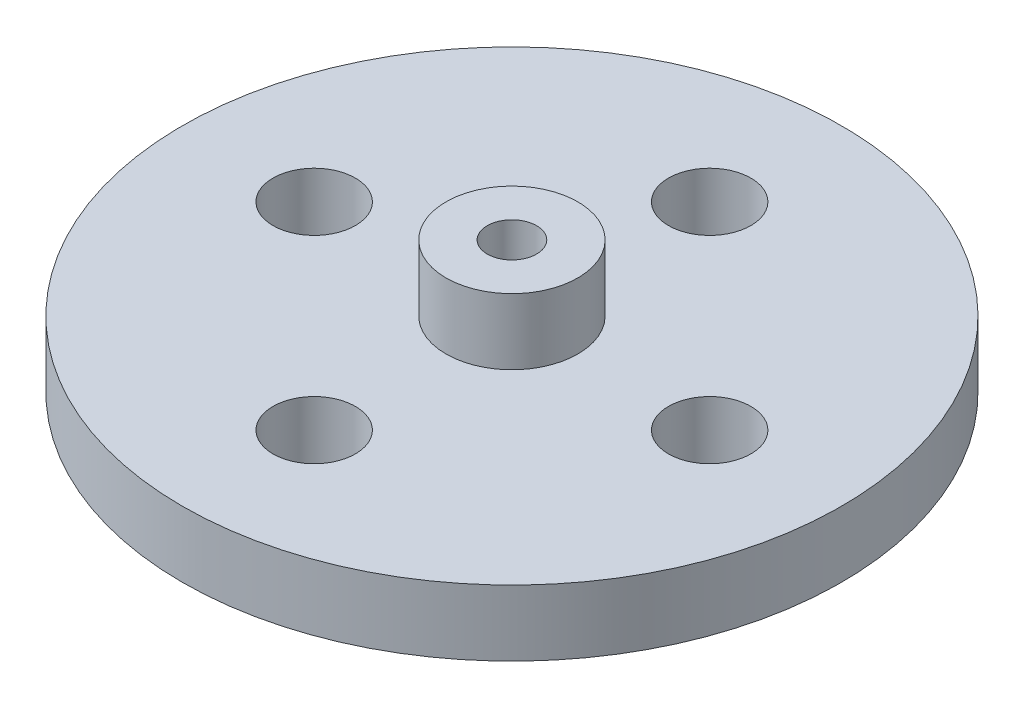
ISO-10303-21;
HEADER;
FILE_DESCRIPTION(('STEP AP214'),'2;1');
FILE_NAME('part.step','',(''),(''),'','','');
FILE_SCHEMA(('AUTOMOTIVE_DESIGN { 1 0 10303 214 1 1 1 1 }'));
ENDSEC;
DATA;
#1=APPLICATION_CONTEXT('core data for automotive mechanical design processes');
#2=APPLICATION_PROTOCOL_DEFINITION('international standard','automotive_design',2000,#1);
#3=PRODUCT_CONTEXT('',#1,'mechanical');
#4=PRODUCT('Part','Part','',(#3));
#5=PRODUCT_RELATED_PRODUCT_CATEGORY('part','',(#4));
#6=PRODUCT_DEFINITION_FORMATION('','',#4);
#7=PRODUCT_DEFINITION_CONTEXT('part definition',#1,'design');
#8=PRODUCT_DEFINITION('design','',#6,#7);
#9=PRODUCT_DEFINITION_SHAPE('','',#8);
#10=(LENGTH_UNIT() NAMED_UNIT(*) SI_UNIT(.MILLI.,.METRE.));
#11=(NAMED_UNIT(*) PLANE_ANGLE_UNIT() SI_UNIT($,.RADIAN.));
#12=(NAMED_UNIT(*) SI_UNIT($,.STERADIAN.) SOLID_ANGLE_UNIT());
#13=UNCERTAINTY_MEASURE_WITH_UNIT(LENGTH_MEASURE(1.E-05),#10,'distance_accuracy_value','');
#14=(GEOMETRIC_REPRESENTATION_CONTEXT(3) GLOBAL_UNCERTAINTY_ASSIGNED_CONTEXT((#13)) GLOBAL_UNIT_ASSIGNED_CONTEXT((#10,
#11,#12)) REPRESENTATION_CONTEXT('',''));
#15=CARTESIAN_POINT('',(0.,0.,0.));
#16=DIRECTION('',(0.,0.,1.));
#17=DIRECTION('',(1.,0.,0.));
#18=AXIS2_PLACEMENT_3D('',#15,#16,#17);
#19=CARTESIAN_POINT('',(0.,6.35,0.));
#20=DIRECTION('',(0.,1.,0.));
#21=DIRECTION('',(0.,0.,1.));
#22=AXIS2_PLACEMENT_3D('',#19,#20,#21);
#23=PLANE('',#22);
#24=CARTESIAN_POINT('',(0.,6.35,-19.05));
#25=DIRECTION('',(0.,1.,0.));
#26=DIRECTION('',(0.,0.,1.));
#27=AXIS2_PLACEMENT_3D('',#24,#25,#26);
#28=CIRCLE('',#27,3.96875);
#29=CARTESIAN_POINT('',(0.,6.35,-15.08125));
#30=VERTEX_POINT('',#29);
#31=EDGE_CURVE('E77',#30,#30,#28,.T.);
#32=ORIENTED_EDGE('',*,*,#31,.F.);
#33=EDGE_LOOP('',(#32));
#34=FACE_BOUND('',#33,.T.);
#35=CARTESIAN_POINT('',(19.05,6.35,0.));
#36=DIRECTION('',(0.,1.,0.));
#37=DIRECTION('',(0.,0.,1.));
#38=AXIS2_PLACEMENT_3D('',#35,#36,#37);
#39=CIRCLE('',#38,3.96875);
#40=CARTESIAN_POINT('',(19.05,6.35,3.96875000000006));
#41=VERTEX_POINT('',#40);
#42=EDGE_CURVE('E64',#41,#41,#39,.T.);
#43=ORIENTED_EDGE('',*,*,#42,.F.);
#44=EDGE_LOOP('',(#43));
#45=FACE_BOUND('',#44,.T.);
#46=CARTESIAN_POINT('',(-1.33025439009923E-13,6.35,19.05));
#47=DIRECTION('',(0.,1.,0.));
#48=DIRECTION('',(0.,0.,1.));
#49=AXIS2_PLACEMENT_3D('',#46,#47,#48);
#50=CIRCLE('',#49,3.96875);
#51=CARTESIAN_POINT('',(-1.33025439009923E-13,6.35,23.01875));
#52=VERTEX_POINT('',#51);
#53=EDGE_CURVE('E61',#52,#52,#50,.T.);
#54=ORIENTED_EDGE('',*,*,#53,.F.);
#55=EDGE_LOOP('',(#54));
#56=FACE_BOUND('',#55,.T.);
#57=CARTESIAN_POINT('',(-19.05,6.35,-1.99538158514885E-13));
#58=DIRECTION('',(0.,1.,0.));
#59=DIRECTION('',(0.,0.,1.));
#60=AXIS2_PLACEMENT_3D('',#57,#58,#59);
#61=CIRCLE('',#60,3.96875);
#62=CARTESIAN_POINT('',(-19.05,6.35,3.9687499999998));
#63=VERTEX_POINT('',#62);
#64=EDGE_CURVE('E60',#63,#63,#61,.T.);
#65=ORIENTED_EDGE('',*,*,#64,.F.);
#66=EDGE_LOOP('',(#65));
#67=FACE_BOUND('',#66,.T.);
#68=CARTESIAN_POINT('',(0.,6.35,0.));
#69=DIRECTION('',(0.,1.,0.));
#70=DIRECTION('',(0.,0.,1.));
#71=AXIS2_PLACEMENT_3D('',#68,#69,#70);
#72=CIRCLE('',#71,31.75);
#73=CARTESIAN_POINT('',(0.,6.35,31.75));
#74=VERTEX_POINT('',#73);
#75=EDGE_CURVE('E10',#74,#74,#72,.T.);
#76=ORIENTED_EDGE('',*,*,#75,.T.);
#77=EDGE_LOOP('',(#76));
#78=FACE_BOUND('',#77,.T.);
#79=CARTESIAN_POINT('',(0.,6.35,0.));
#80=DIRECTION('',(0.,1.,0.));
#81=DIRECTION('',(0.,0.,1.));
#82=AXIS2_PLACEMENT_3D('',#79,#80,#81);
#83=CIRCLE('',#82,6.35);
#84=CARTESIAN_POINT('',(0.,6.35,6.35));
#85=VERTEX_POINT('',#84);
#86=EDGE_CURVE('E55',#85,#85,#83,.T.);
#87=ORIENTED_EDGE('',*,*,#86,.F.);
#88=EDGE_LOOP('',(#87));
#89=FACE_BOUND('',#88,.T.);
#90=ADVANCED_FACE('F36',(#34,#45,#56,#67,#78,#89),#23,.T.);
#91=CARTESIAN_POINT('',(0.,6.35,0.));
#92=DIRECTION('',(0.,-1.,0.));
#93=DIRECTION('',(0.,0.,-1.));
#94=AXIS2_PLACEMENT_3D('',#91,#92,#93);
#95=CYLINDRICAL_SURFACE('',#94,31.75);
#96=ORIENTED_EDGE('',*,*,#75,.F.);
#97=EDGE_LOOP('',(#96));
#98=FACE_BOUND('',#97,.T.);
#99=CARTESIAN_POINT('',(0.,0.,0.));
#100=DIRECTION('',(0.,1.,0.));
#101=DIRECTION('',(0.,0.,1.));
#102=AXIS2_PLACEMENT_3D('',#99,#100,#101);
#103=CIRCLE('',#102,31.75);
#104=CARTESIAN_POINT('',(0.,0.,31.75));
#105=VERTEX_POINT('',#104);
#106=EDGE_CURVE('E45',#105,#105,#103,.T.);
#107=ORIENTED_EDGE('',*,*,#106,.T.);
#108=EDGE_LOOP('',(#107));
#109=FACE_BOUND('',#108,.T.);
#110=ADVANCED_FACE('F38',(#98,#109),#95,.T.);
#111=CARTESIAN_POINT('',(0.,0.,0.));
#112=DIRECTION('',(0.,1.,0.));
#113=DIRECTION('',(0.,0.,1.));
#114=AXIS2_PLACEMENT_3D('',#111,#112,#113);
#115=PLANE('',#114);
#116=CARTESIAN_POINT('',(0.,0.,-19.05));
#117=DIRECTION('',(0.,1.,0.));
#118=DIRECTION('',(0.,0.,1.));
#119=AXIS2_PLACEMENT_3D('',#116,#117,#118);
#120=CIRCLE('',#119,3.96875);
#121=CARTESIAN_POINT('',(0.,0.,-15.08125));
#122=VERTEX_POINT('',#121);
#123=EDGE_CURVE('E40',#122,#122,#120,.T.);
#124=ORIENTED_EDGE('',*,*,#123,.T.);
#125=EDGE_LOOP('',(#124));
#126=FACE_BOUND('',#125,.T.);
#127=CARTESIAN_POINT('',(19.05,0.,0.));
#128=DIRECTION('',(0.,1.,0.));
#129=DIRECTION('',(0.,0.,1.));
#130=AXIS2_PLACEMENT_3D('',#127,#128,#129);
#131=CIRCLE('',#130,3.96875);
#132=CARTESIAN_POINT('',(19.05,0.,3.96875000000006));
#133=VERTEX_POINT('',#132);
#134=EDGE_CURVE('E62',#133,#133,#131,.T.);
#135=ORIENTED_EDGE('',*,*,#134,.T.);
#136=EDGE_LOOP('',(#135));
#137=FACE_BOUND('',#136,.T.);
#138=CARTESIAN_POINT('',(-1.33025439009923E-13,0.,19.05));
#139=DIRECTION('',(0.,1.,0.));
#140=DIRECTION('',(0.,0.,1.));
#141=AXIS2_PLACEMENT_3D('',#138,#139,#140);
#142=CIRCLE('',#141,3.96875);
#143=CARTESIAN_POINT('',(-1.33025439009923E-13,0.,23.01875));
#144=VERTEX_POINT('',#143);
#145=EDGE_CURVE('E58',#144,#144,#142,.T.);
#146=ORIENTED_EDGE('',*,*,#145,.T.);
#147=EDGE_LOOP('',(#146));
#148=FACE_BOUND('',#147,.T.);
#149=CARTESIAN_POINT('',(-19.05,0.,-1.99538158514885E-13));
#150=DIRECTION('',(0.,1.,0.));
#151=DIRECTION('',(0.,0.,1.));
#152=AXIS2_PLACEMENT_3D('',#149,#150,#151);
#153=CIRCLE('',#152,3.96875);
#154=CARTESIAN_POINT('',(-19.05,0.,3.9687499999998));
#155=VERTEX_POINT('',#154);
#156=EDGE_CURVE('E82',#155,#155,#153,.T.);
#157=ORIENTED_EDGE('',*,*,#156,.T.);
#158=EDGE_LOOP('',(#157));
#159=FACE_BOUND('',#158,.T.);
#160=CARTESIAN_POINT('',(0.,0.,0.));
#161=DIRECTION('',(0.,1.,0.));
#162=DIRECTION('',(0.,0.,1.));
#163=AXIS2_PLACEMENT_3D('',#160,#161,#162);
#164=CIRCLE('',#163,2.3749);
#165=CARTESIAN_POINT('',(0.,0.,2.3749));
#166=VERTEX_POINT('',#165);
#167=EDGE_CURVE('E86',#166,#166,#164,.T.);
#168=ORIENTED_EDGE('',*,*,#167,.T.);
#169=EDGE_LOOP('',(#168));
#170=FACE_BOUND('',#169,.T.);
#171=ORIENTED_EDGE('',*,*,#106,.F.);
#172=EDGE_LOOP('',(#171));
#173=FACE_BOUND('',#172,.T.);
#174=ADVANCED_FACE('F108',(#126,#137,#148,#159,#170,#173),#115,.F.);
#175=CARTESIAN_POINT('',(0.,12.7,0.));
#176=DIRECTION('',(0.,-1.,0.));
#177=DIRECTION('',(0.,0.,-1.));
#178=AXIS2_PLACEMENT_3D('',#175,#176,#177);
#179=CYLINDRICAL_SURFACE('',#178,6.35);
#180=CARTESIAN_POINT('',(0.,12.7,0.));
#181=DIRECTION('',(0.,1.,0.));
#182=DIRECTION('',(0.,0.,1.));
#183=AXIS2_PLACEMENT_3D('',#180,#181,#182);
#184=CIRCLE('',#183,6.35);
#185=CARTESIAN_POINT('',(0.,12.7,6.35));
#186=VERTEX_POINT('',#185);
#187=EDGE_CURVE('E52',#186,#186,#184,.T.);
#188=ORIENTED_EDGE('',*,*,#187,.F.);
#189=EDGE_LOOP('',(#188));
#190=FACE_BOUND('',#189,.T.);
#191=ORIENTED_EDGE('',*,*,#86,.T.);
#192=EDGE_LOOP('',(#191));
#193=FACE_BOUND('',#192,.T.);
#194=ADVANCED_FACE('F100',(#190,#193),#179,.T.);
#195=CARTESIAN_POINT('',(0.,12.7,0.));
#196=DIRECTION('',(0.,1.,0.));
#197=DIRECTION('',(0.,0.,1.));
#198=AXIS2_PLACEMENT_3D('',#195,#196,#197);
#199=PLANE('',#198);
#200=CARTESIAN_POINT('',(0.,12.7,0.));
#201=DIRECTION('',(0.,1.,0.));
#202=DIRECTION('',(0.,0.,1.));
#203=AXIS2_PLACEMENT_3D('',#200,#201,#202);
#204=CIRCLE('',#203,2.3749);
#205=CARTESIAN_POINT('',(0.,12.7,2.3749));
#206=VERTEX_POINT('',#205);
#207=EDGE_CURVE('E85',#206,#206,#204,.T.);
#208=ORIENTED_EDGE('',*,*,#207,.F.);
#209=EDGE_LOOP('',(#208));
#210=FACE_BOUND('',#209,.T.);
#211=ORIENTED_EDGE('',*,*,#187,.T.);
#212=EDGE_LOOP('',(#211));
#213=FACE_BOUND('',#212,.T.);
#214=ADVANCED_FACE('F119',(#210,#213),#199,.T.);
#215=CARTESIAN_POINT('',(0.,0.,0.));
#216=DIRECTION('',(0.,1.,0.));
#217=DIRECTION('',(0.,0.,1.));
#218=AXIS2_PLACEMENT_3D('',#215,#216,#217);
#219=CYLINDRICAL_SURFACE('',#218,2.3749);
#220=ORIENTED_EDGE('',*,*,#167,.F.);
#221=EDGE_LOOP('',(#220));
#222=FACE_BOUND('',#221,.T.);
#223=ORIENTED_EDGE('',*,*,#207,.T.);
#224=EDGE_LOOP('',(#223));
#225=FACE_BOUND('',#224,.T.);
#226=ADVANCED_FACE('F132',(#222,#225),#219,.F.);
#227=CARTESIAN_POINT('',(-19.05,6.35,-1.99538158514885E-13));
#228=DIRECTION('',(0.,1.,0.));
#229=DIRECTION('',(0.,0.,1.));
#230=AXIS2_PLACEMENT_3D('',#227,#228,#229);
#231=CYLINDRICAL_SURFACE('',#230,3.96875);
#232=ORIENTED_EDGE('',*,*,#64,.T.);
#233=EDGE_LOOP('',(#232));
#234=FACE_BOUND('',#233,.T.);
#235=ORIENTED_EDGE('',*,*,#156,.F.);
#236=EDGE_LOOP('',(#235));
#237=FACE_BOUND('',#236,.T.);
#238=ADVANCED_FACE('F135',(#234,#237),#231,.F.);
#239=CARTESIAN_POINT('',(-1.33025439009923E-13,6.35,19.05));
#240=DIRECTION('',(0.,1.,0.));
#241=DIRECTION('',(0.,0.,1.));
#242=AXIS2_PLACEMENT_3D('',#239,#240,#241);
#243=CYLINDRICAL_SURFACE('',#242,3.96875);
#244=ORIENTED_EDGE('',*,*,#53,.T.);
#245=EDGE_LOOP('',(#244));
#246=FACE_BOUND('',#245,.T.);
#247=ORIENTED_EDGE('',*,*,#145,.F.);
#248=EDGE_LOOP('',(#247));
#249=FACE_BOUND('',#248,.T.);
#250=ADVANCED_FACE('F145',(#246,#249),#243,.F.);
#251=CARTESIAN_POINT('',(19.05,6.35,0.));
#252=DIRECTION('',(0.,1.,0.));
#253=DIRECTION('',(0.,0.,1.));
#254=AXIS2_PLACEMENT_3D('',#251,#252,#253);
#255=CYLINDRICAL_SURFACE('',#254,3.96875);
#256=ORIENTED_EDGE('',*,*,#42,.T.);
#257=EDGE_LOOP('',(#256));
#258=FACE_BOUND('',#257,.T.);
#259=ORIENTED_EDGE('',*,*,#134,.F.);
#260=EDGE_LOOP('',(#259));
#261=FACE_BOUND('',#260,.T.);
#262=ADVANCED_FACE('F149',(#258,#261),#255,.F.);
#263=CARTESIAN_POINT('',(0.,6.35,-19.05));
#264=DIRECTION('',(0.,1.,0.));
#265=DIRECTION('',(0.,0.,1.));
#266=AXIS2_PLACEMENT_3D('',#263,#264,#265);
#267=CYLINDRICAL_SURFACE('',#266,3.96875);
#268=ORIENTED_EDGE('',*,*,#31,.T.);
#269=EDGE_LOOP('',(#268));
#270=FACE_BOUND('',#269,.T.);
#271=ORIENTED_EDGE('',*,*,#123,.F.);
#272=EDGE_LOOP('',(#271));
#273=FACE_BOUND('',#272,.T.);
#274=ADVANCED_FACE('F153',(#270,#273),#267,.F.);
#275=CLOSED_SHELL('',(#90,#110,#174,#194,#214,#226,#238,#250,#262,#274));
#276=MANIFOLD_SOLID_BREP('B2',#275);
#277=ADVANCED_BREP_SHAPE_REPRESENTATION('',(#18,#276),#14);
#278=SHAPE_DEFINITION_REPRESENTATION(#9,#277);
ENDSEC;
END-ISO-10303-21;
